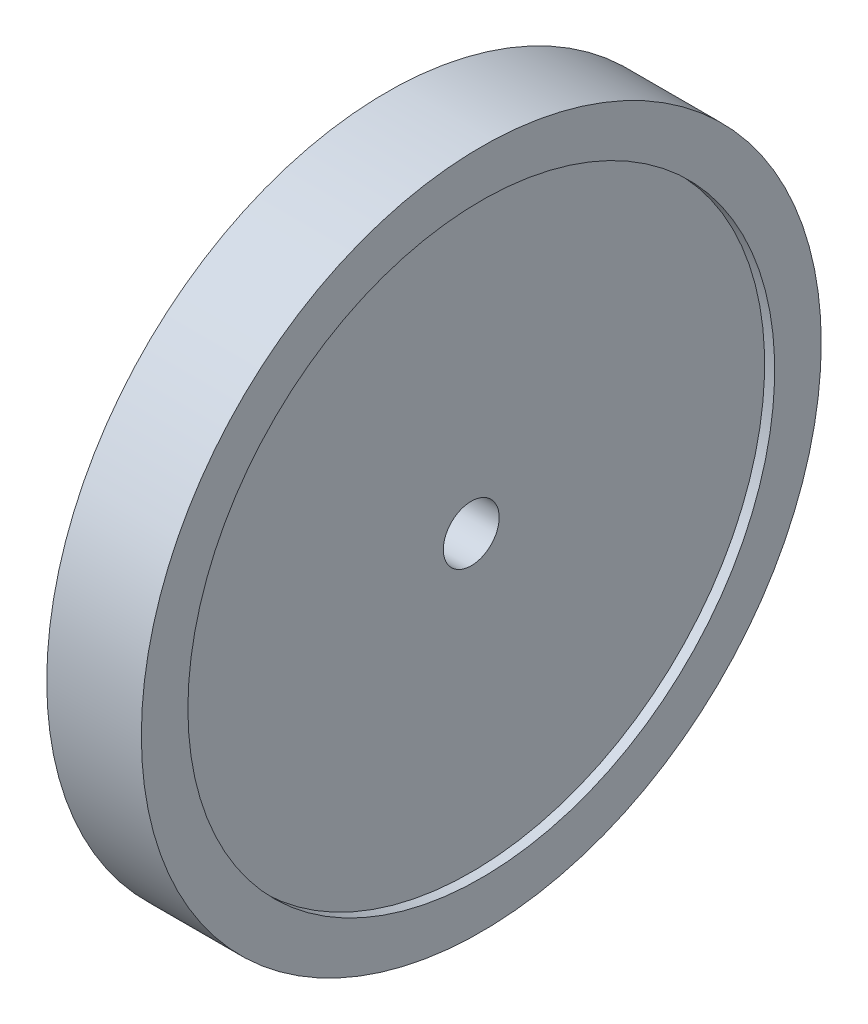
ISO-10303-21;
HEADER;
FILE_DESCRIPTION(('STEP AP214'),'2;1');
FILE_NAME('part.step','',(''),(''),'','','');
FILE_SCHEMA(('AUTOMOTIVE_DESIGN { 1 0 10303 214 1 1 1 1 }'));
ENDSEC;
DATA;
#1=APPLICATION_CONTEXT('core data for automotive mechanical design processes');
#2=APPLICATION_PROTOCOL_DEFINITION('international standard','automotive_design',2000,#1);
#3=PRODUCT_CONTEXT('',#1,'mechanical');
#4=PRODUCT('Part','Part','',(#3));
#5=PRODUCT_RELATED_PRODUCT_CATEGORY('part','',(#4));
#6=PRODUCT_DEFINITION_FORMATION('','',#4);
#7=PRODUCT_DEFINITION_CONTEXT('part definition',#1,'design');
#8=PRODUCT_DEFINITION('design','',#6,#7);
#9=PRODUCT_DEFINITION_SHAPE('','',#8);
#10=(LENGTH_UNIT() NAMED_UNIT(*) SI_UNIT(.MILLI.,.METRE.));
#11=(NAMED_UNIT(*) PLANE_ANGLE_UNIT() SI_UNIT($,.RADIAN.));
#12=(NAMED_UNIT(*) SI_UNIT($,.STERADIAN.) SOLID_ANGLE_UNIT());
#13=UNCERTAINTY_MEASURE_WITH_UNIT(LENGTH_MEASURE(1.E-05),#10,'distance_accuracy_value','');
#14=(GEOMETRIC_REPRESENTATION_CONTEXT(3) GLOBAL_UNCERTAINTY_ASSIGNED_CONTEXT((#13)) GLOBAL_UNIT_ASSIGNED_CONTEXT((#10,
#11,#12)) REPRESENTATION_CONTEXT('',''));
#15=CARTESIAN_POINT('',(0.,0.,0.));
#16=DIRECTION('',(0.,0.,1.));
#17=DIRECTION('',(1.,0.,0.));
#18=AXIS2_PLACEMENT_3D('',#15,#16,#17);
#19=CARTESIAN_POINT('',(-4.,0.,0.));
#20=DIRECTION('',(1.,0.,0.));
#21=DIRECTION('',(0.,0.,-1.));
#22=AXIS2_PLACEMENT_3D('',#19,#20,#21);
#23=PLANE('',#22);
#24=CARTESIAN_POINT('',(-4.,0.,0.));
#25=DIRECTION('',(1.,0.,0.));
#26=DIRECTION('',(0.,0.,-1.));
#27=AXIS2_PLACEMENT_3D('',#24,#25,#26);
#28=CIRCLE('',#27,3.);
#29=CARTESIAN_POINT('',(-4.,0.,-3.));
#30=VERTEX_POINT('',#29);
#31=EDGE_CURVE('E57',#30,#30,#28,.T.);
#32=ORIENTED_EDGE('',*,*,#31,.T.);
#33=EDGE_LOOP('',(#32));
#34=FACE_BOUND('',#33,.T.);
#35=CARTESIAN_POINT('',(-4.,0.,0.));
#36=DIRECTION('',(-1.,0.,0.));
#37=DIRECTION('',(0.,0.,1.));
#38=AXIS2_PLACEMENT_3D('',#35,#36,#37);
#39=CIRCLE('',#38,31.5125);
#40=CARTESIAN_POINT('',(-4.,0.,31.5125));
#41=VERTEX_POINT('',#40);
#42=EDGE_CURVE('E54',#41,#41,#39,.T.);
#43=ORIENTED_EDGE('',*,*,#42,.T.);
#44=EDGE_LOOP('',(#43));
#45=FACE_BOUND('',#44,.T.);
#46=ADVANCED_FACE('F32',(#34,#45),#23,.F.);
#47=CARTESIAN_POINT('',(4.,0.,0.));
#48=DIRECTION('',(-1.,0.,0.));
#49=DIRECTION('',(0.,0.,1.));
#50=AXIS2_PLACEMENT_3D('',#47,#48,#49);
#51=PLANE('',#50);
#52=CARTESIAN_POINT('',(4.,0.,0.));
#53=DIRECTION('',(1.,0.,0.));
#54=DIRECTION('',(0.,0.,-1.));
#55=AXIS2_PLACEMENT_3D('',#52,#53,#54);
#56=CIRCLE('',#55,3.);
#57=CARTESIAN_POINT('',(4.,0.,-3.));
#58=VERTEX_POINT('',#57);
#59=EDGE_CURVE('E60',#58,#58,#56,.T.);
#60=ORIENTED_EDGE('',*,*,#59,.F.);
#61=EDGE_LOOP('',(#60));
#62=FACE_BOUND('',#61,.T.);
#63=CARTESIAN_POINT('',(4.,0.,0.));
#64=DIRECTION('',(-1.,0.,0.));
#65=DIRECTION('',(0.,0.,1.));
#66=AXIS2_PLACEMENT_3D('',#63,#64,#65);
#67=CIRCLE('',#66,31.5125);
#68=CARTESIAN_POINT('',(4.,0.,31.5125));
#69=VERTEX_POINT('',#68);
#70=EDGE_CURVE('E10',#69,#69,#67,.T.);
#71=ORIENTED_EDGE('',*,*,#70,.F.);
#72=EDGE_LOOP('',(#71));
#73=FACE_BOUND('',#72,.T.);
#74=ADVANCED_FACE('F67',(#62,#73),#51,.F.);
#75=CARTESIAN_POINT('',(-4.,0.,0.));
#76=DIRECTION('',(-1.,0.,0.));
#77=DIRECTION('',(0.,0.,1.));
#78=AXIS2_PLACEMENT_3D('',#75,#76,#77);
#79=CYLINDRICAL_SURFACE('',#78,31.5125);
#80=CARTESIAN_POINT('',(5.08,0.,0.));
#81=DIRECTION('',(-1.,0.,0.));
#82=DIRECTION('',(0.,0.,1.));
#83=AXIS2_PLACEMENT_3D('',#80,#81,#82);
#84=CIRCLE('',#83,31.5125);
#85=CARTESIAN_POINT('',(5.08,0.,31.5125));
#86=VERTEX_POINT('',#85);
#87=EDGE_CURVE('E38',#86,#86,#84,.T.);
#88=ORIENTED_EDGE('',*,*,#87,.F.);
#89=EDGE_LOOP('',(#88));
#90=FACE_BOUND('',#89,.T.);
#91=ORIENTED_EDGE('',*,*,#70,.T.);
#92=EDGE_LOOP('',(#91));
#93=FACE_BOUND('',#92,.T.);
#94=ADVANCED_FACE('F70',(#90,#93),#79,.F.);
#95=CARTESIAN_POINT('',(5.08,36.5125,0.));
#96=DIRECTION('',(-1.,0.,0.));
#97=DIRECTION('',(0.,0.,1.));
#98=AXIS2_PLACEMENT_3D('',#95,#96,#97);
#99=PLANE('',#98);
#100=CARTESIAN_POINT('',(5.08,0.,0.));
#101=DIRECTION('',(-1.,0.,0.));
#102=DIRECTION('',(0.,0.,1.));
#103=AXIS2_PLACEMENT_3D('',#100,#101,#102);
#104=CIRCLE('',#103,36.5125);
#105=CARTESIAN_POINT('',(5.08,0.,36.5125));
#106=VERTEX_POINT('',#105);
#107=EDGE_CURVE('E42',#106,#106,#104,.T.);
#108=ORIENTED_EDGE('',*,*,#107,.F.);
#109=EDGE_LOOP('',(#108));
#110=FACE_BOUND('',#109,.T.);
#111=ORIENTED_EDGE('',*,*,#87,.T.);
#112=EDGE_LOOP('',(#111));
#113=FACE_BOUND('',#112,.T.);
#114=ADVANCED_FACE('F75',(#110,#113),#99,.F.);
#115=CARTESIAN_POINT('',(-4.,0.,0.));
#116=DIRECTION('',(-1.,0.,0.));
#117=DIRECTION('',(0.,0.,1.));
#118=AXIS2_PLACEMENT_3D('',#115,#116,#117);
#119=CYLINDRICAL_SURFACE('',#118,36.5125);
#120=CARTESIAN_POINT('',(-5.08,0.,0.));
#121=DIRECTION('',(-1.,0.,0.));
#122=DIRECTION('',(0.,0.,1.));
#123=AXIS2_PLACEMENT_3D('',#120,#121,#122);
#124=CIRCLE('',#123,36.5125);
#125=CARTESIAN_POINT('',(-5.08,0.,36.5125));
#126=VERTEX_POINT('',#125);
#127=EDGE_CURVE('E46',#126,#126,#124,.T.);
#128=ORIENTED_EDGE('',*,*,#127,.F.);
#129=EDGE_LOOP('',(#128));
#130=FACE_BOUND('',#129,.T.);
#131=ORIENTED_EDGE('',*,*,#107,.T.);
#132=EDGE_LOOP('',(#131));
#133=FACE_BOUND('',#132,.T.);
#134=ADVANCED_FACE('F82',(#130,#133),#119,.T.);
#135=CARTESIAN_POINT('',(-5.08,31.5125,0.));
#136=DIRECTION('',(1.,0.,0.));
#137=DIRECTION('',(0.,0.,-1.));
#138=AXIS2_PLACEMENT_3D('',#135,#136,#137);
#139=PLANE('',#138);
#140=CARTESIAN_POINT('',(-5.08,0.,0.));
#141=DIRECTION('',(-1.,0.,0.));
#142=DIRECTION('',(0.,0.,1.));
#143=AXIS2_PLACEMENT_3D('',#140,#141,#142);
#144=CIRCLE('',#143,31.5125);
#145=CARTESIAN_POINT('',(-5.08,0.,31.5125));
#146=VERTEX_POINT('',#145);
#147=EDGE_CURVE('E51',#146,#146,#144,.T.);
#148=ORIENTED_EDGE('',*,*,#147,.F.);
#149=EDGE_LOOP('',(#148));
#150=FACE_BOUND('',#149,.T.);
#151=ORIENTED_EDGE('',*,*,#127,.T.);
#152=EDGE_LOOP('',(#151));
#153=FACE_BOUND('',#152,.T.);
#154=ADVANCED_FACE('F86',(#150,#153),#139,.F.);
#155=CARTESIAN_POINT('',(-4.,0.,0.));
#156=DIRECTION('',(-1.,0.,0.));
#157=DIRECTION('',(0.,0.,1.));
#158=AXIS2_PLACEMENT_3D('',#155,#156,#157);
#159=CYLINDRICAL_SURFACE('',#158,31.5125);
#160=ORIENTED_EDGE('',*,*,#42,.F.);
#161=EDGE_LOOP('',(#160));
#162=FACE_BOUND('',#161,.T.);
#163=ORIENTED_EDGE('',*,*,#147,.T.);
#164=EDGE_LOOP('',(#163));
#165=FACE_BOUND('',#164,.T.);
#166=ADVANCED_FACE('F90',(#162,#165),#159,.F.);
#167=CARTESIAN_POINT('',(-5.08,0.,0.));
#168=DIRECTION('',(1.,0.,0.));
#169=DIRECTION('',(0.,0.,-1.));
#170=AXIS2_PLACEMENT_3D('',#167,#168,#169);
#171=CYLINDRICAL_SURFACE('',#170,3.);
#172=ORIENTED_EDGE('',*,*,#59,.T.);
#173=EDGE_LOOP('',(#172));
#174=FACE_BOUND('',#173,.T.);
#175=ORIENTED_EDGE('',*,*,#31,.F.);
#176=EDGE_LOOP('',(#175));
#177=FACE_BOUND('',#176,.T.);
#178=ADVANCED_FACE('F64',(#174,#177),#171,.F.);
#179=CLOSED_SHELL('',(#46,#74,#94,#114,#134,#154,#166,#178));
#180=MANIFOLD_SOLID_BREP('B2',#179);
#181=ADVANCED_BREP_SHAPE_REPRESENTATION('',(#18,#180),#14);
#182=SHAPE_DEFINITION_REPRESENTATION(#9,#181);
ENDSEC;
END-ISO-10303-21;
